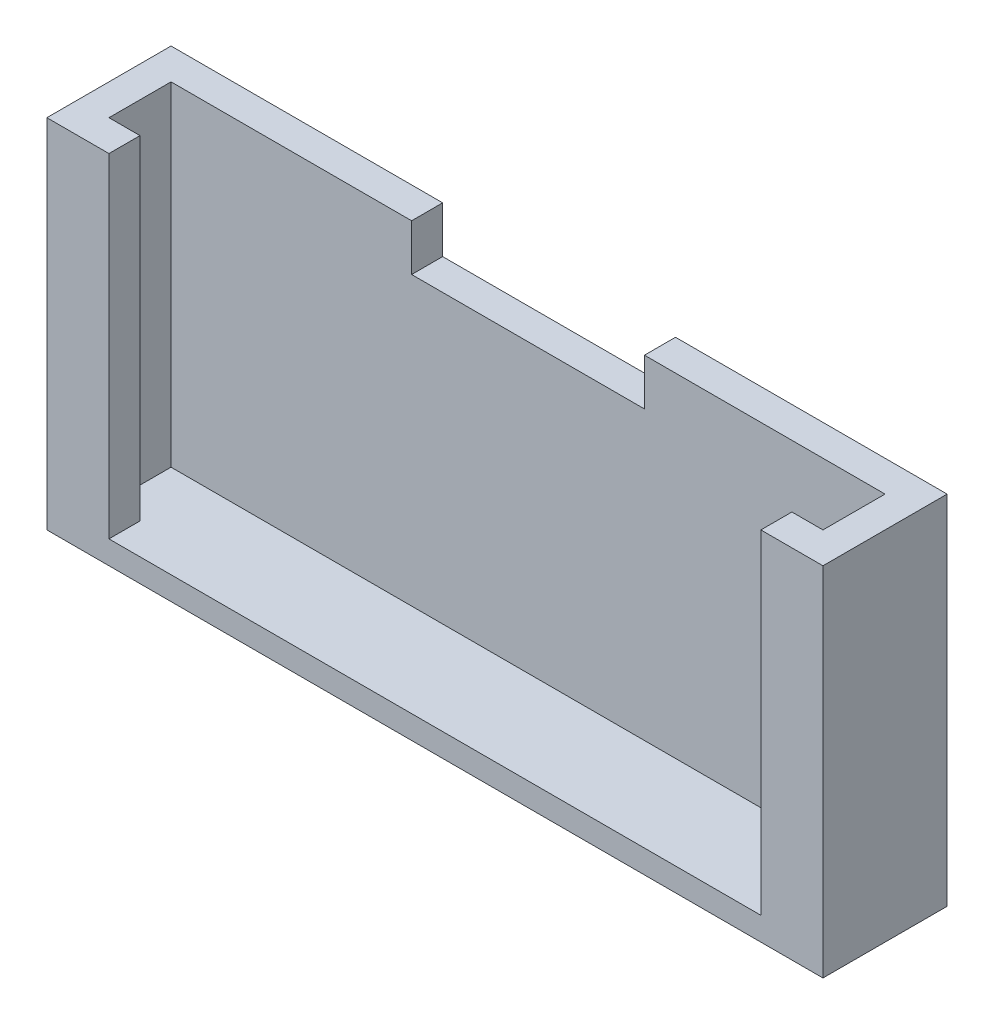
ISO-10303-21;
HEADER;
FILE_DESCRIPTION(('STEP AP214'),'2;1');
FILE_NAME('part.step','',(''),(''),'','','');
FILE_SCHEMA(('AUTOMOTIVE_DESIGN { 1 0 10303 214 1 1 1 1 }'));
ENDSEC;
DATA;
#1=APPLICATION_CONTEXT('core data for automotive mechanical design processes');
#2=APPLICATION_PROTOCOL_DEFINITION('international standard','automotive_design',2000,#1);
#3=PRODUCT_CONTEXT('',#1,'mechanical');
#4=PRODUCT('Part','Part','',(#3));
#5=PRODUCT_RELATED_PRODUCT_CATEGORY('part','',(#4));
#6=PRODUCT_DEFINITION_FORMATION('','',#4);
#7=PRODUCT_DEFINITION_CONTEXT('part definition',#1,'design');
#8=PRODUCT_DEFINITION('design','',#6,#7);
#9=PRODUCT_DEFINITION_SHAPE('','',#8);
#10=(LENGTH_UNIT() NAMED_UNIT(*) SI_UNIT(.MILLI.,.METRE.));
#11=(NAMED_UNIT(*) PLANE_ANGLE_UNIT() SI_UNIT($,.RADIAN.));
#12=(NAMED_UNIT(*) SI_UNIT($,.STERADIAN.) SOLID_ANGLE_UNIT());
#13=UNCERTAINTY_MEASURE_WITH_UNIT(LENGTH_MEASURE(1.E-05),#10,'distance_accuracy_value','');
#14=(GEOMETRIC_REPRESENTATION_CONTEXT(3) GLOBAL_UNCERTAINTY_ASSIGNED_CONTEXT((#13)) GLOBAL_UNIT_ASSIGNED_CONTEXT((#10,
#11,#12)) REPRESENTATION_CONTEXT('',''));
#15=CARTESIAN_POINT('',(0.,0.,0.));
#16=DIRECTION('',(0.,0.,1.));
#17=DIRECTION('',(1.,0.,0.));
#18=AXIS2_PLACEMENT_3D('',#15,#16,#17);
#19=CARTESIAN_POINT('',(-25.,11.5,2.));
#20=DIRECTION('',(0.,-1.,0.));
#21=DIRECTION('',(0.,0.,-1.));
#22=AXIS2_PLACEMENT_3D('',#19,#20,#21);
#23=PLANE('',#22);
#24=DIRECTION('',(-1.,0.,0.));
#25=VECTOR('',#24,1.);
#26=CARTESIAN_POINT('',(-25.,11.5,0.));
#27=LINE('',#26,#25);
#28=CARTESIAN_POINT('',(25.,11.5,0.));
#29=VERTEX_POINT('',#28);
#30=CARTESIAN_POINT('',(7.50000000000001,11.5,0.));
#31=VERTEX_POINT('',#30);
#32=EDGE_CURVE('E255',#29,#31,#27,.T.);
#33=ORIENTED_EDGE('',*,*,#32,.T.);
#34=DIRECTION('',(0.,0.,1.));
#35=VECTOR('',#34,1.);
#36=CARTESIAN_POINT('',(7.5,11.5,2.));
#37=LINE('',#36,#35);
#38=CARTESIAN_POINT('',(7.50000000000001,11.5,2.));
#39=VERTEX_POINT('',#38);
#40=EDGE_CURVE('E178',#31,#39,#37,.T.);
#41=ORIENTED_EDGE('',*,*,#40,.T.);
#42=DIRECTION('',(-1.,0.,0.));
#43=VECTOR('',#42,1.);
#44=CARTESIAN_POINT('',(-23.,11.5,2.));
#45=LINE('',#44,#43);
#46=CARTESIAN_POINT('',(23.,11.5,2.));
#47=VERTEX_POINT('',#46);
#48=EDGE_CURVE('E224',#47,#39,#45,.T.);
#49=ORIENTED_EDGE('',*,*,#48,.F.);
#50=DIRECTION('',(0.,0.,1.));
#51=VECTOR('',#50,1.);
#52=CARTESIAN_POINT('',(23.,11.5,2.));
#53=LINE('',#52,#51);
#54=CARTESIAN_POINT('',(23.,11.5,6.));
#55=VERTEX_POINT('',#54);
#56=EDGE_CURVE('E227',#47,#55,#53,.T.);
#57=ORIENTED_EDGE('',*,*,#56,.T.);
#58=DIRECTION('',(1.,0.,0.));
#59=VECTOR('',#58,1.);
#60=CARTESIAN_POINT('',(21.,11.5,6.));
#61=LINE('',#60,#59);
#62=CARTESIAN_POINT('',(21.,11.5,6.));
#63=VERTEX_POINT('',#62);
#64=EDGE_CURVE('E212',#63,#55,#61,.T.);
#65=ORIENTED_EDGE('',*,*,#64,.F.);
#66=DIRECTION('',(0.,0.,-1.));
#67=VECTOR('',#66,1.);
#68=CARTESIAN_POINT('',(21.,11.5,0.));
#69=LINE('',#68,#67);
#70=CARTESIAN_POINT('',(21.,11.5,8.));
#71=VERTEX_POINT('',#70);
#72=EDGE_CURVE('E196',#71,#63,#69,.T.);
#73=ORIENTED_EDGE('',*,*,#72,.F.);
#74=DIRECTION('',(-1.,0.,0.));
#75=VECTOR('',#74,1.);
#76=CARTESIAN_POINT('',(-25.,11.5,8.));
#77=LINE('',#76,#75);
#78=CARTESIAN_POINT('',(25.,11.5,8.));
#79=VERTEX_POINT('',#78);
#80=EDGE_CURVE('E250',#79,#71,#77,.T.);
#81=ORIENTED_EDGE('',*,*,#80,.F.);
#82=DIRECTION('',(0.,0.,-1.));
#83=VECTOR('',#82,1.);
#84=CARTESIAN_POINT('',(25.,11.5,2.));
#85=LINE('',#84,#83);
#86=EDGE_CURVE('E43',#79,#29,#85,.T.);
#87=ORIENTED_EDGE('',*,*,#86,.T.);
#88=EDGE_LOOP('',(#33,#41,#49,#57,#65,#73,#81,#87));
#89=FACE_BOUND('',#88,.T.);
#90=ADVANCED_FACE('F35',(#89),#23,.F.);
#91=CARTESIAN_POINT('',(-23.,-10.,4.));
#92=DIRECTION('',(0.,-1.,0.));
#93=DIRECTION('',(0.,0.,-1.));
#94=AXIS2_PLACEMENT_3D('',#91,#92,#93);
#95=PLANE('',#94);
#96=DIRECTION('',(-1.,0.,0.));
#97=VECTOR('',#96,1.);
#98=CARTESIAN_POINT('',(-21.,-10.,6.));
#99=LINE('',#98,#97);
#100=CARTESIAN_POINT('',(-21.,-10.,6.));
#101=VERTEX_POINT('',#100);
#102=CARTESIAN_POINT('',(-23.,-10.,6.));
#103=VERTEX_POINT('',#102);
#104=EDGE_CURVE('E193',#101,#103,#99,.T.);
#105=ORIENTED_EDGE('',*,*,#104,.F.);
#106=DIRECTION('',(0.,0.,-1.));
#107=VECTOR('',#106,1.);
#108=CARTESIAN_POINT('',(-21.,-10.,8.));
#109=LINE('',#108,#107);
#110=CARTESIAN_POINT('',(-21.,-10.,8.));
#111=VERTEX_POINT('',#110);
#112=EDGE_CURVE('E184',#111,#101,#109,.T.);
#113=ORIENTED_EDGE('',*,*,#112,.F.);
#114=DIRECTION('',(1.,0.,0.));
#115=VECTOR('',#114,1.);
#116=CARTESIAN_POINT('',(-23.,-10.,8.));
#117=LINE('',#116,#115);
#118=CARTESIAN_POINT('',(21.,-10.,8.));
#119=VERTEX_POINT('',#118);
#120=EDGE_CURVE('E232',#111,#119,#117,.T.);
#121=ORIENTED_EDGE('',*,*,#120,.T.);
#122=DIRECTION('',(0.,0.,1.));
#123=VECTOR('',#122,1.);
#124=CARTESIAN_POINT('',(21.,-10.,0.));
#125=LINE('',#124,#123);
#126=CARTESIAN_POINT('',(21.,-10.,6.));
#127=VERTEX_POINT('',#126);
#128=EDGE_CURVE('E202',#127,#119,#125,.T.);
#129=ORIENTED_EDGE('',*,*,#128,.F.);
#130=DIRECTION('',(1.,0.,0.));
#131=VECTOR('',#130,1.);
#132=CARTESIAN_POINT('',(21.,-10.,6.));
#133=LINE('',#132,#131);
#134=CARTESIAN_POINT('',(23.,-10.,6.));
#135=VERTEX_POINT('',#134);
#136=EDGE_CURVE('E208',#127,#135,#133,.T.);
#137=ORIENTED_EDGE('',*,*,#136,.T.);
#138=DIRECTION('',(0.,0.,1.));
#139=VECTOR('',#138,1.);
#140=CARTESIAN_POINT('',(23.,-10.,4.));
#141=LINE('',#140,#139);
#142=CARTESIAN_POINT('',(23.,-10.,2.));
#143=VERTEX_POINT('',#142);
#144=EDGE_CURVE('E235',#143,#135,#141,.T.);
#145=ORIENTED_EDGE('',*,*,#144,.F.);
#146=DIRECTION('',(1.,0.,0.));
#147=VECTOR('',#146,1.);
#148=CARTESIAN_POINT('',(-23.,-10.,2.));
#149=LINE('',#148,#147);
#150=CARTESIAN_POINT('',(-23.,-10.,2.));
#151=VERTEX_POINT('',#150);
#152=EDGE_CURVE('E217',#151,#143,#149,.T.);
#153=ORIENTED_EDGE('',*,*,#152,.F.);
#154=DIRECTION('',(0.,0.,1.));
#155=VECTOR('',#154,1.);
#156=CARTESIAN_POINT('',(-23.,-10.,4.));
#157=LINE('',#156,#155);
#158=EDGE_CURVE('E234',#151,#103,#157,.T.);
#159=ORIENTED_EDGE('',*,*,#158,.T.);
#160=EDGE_LOOP('',(#105,#113,#121,#129,#137,#145,#153,#159));
#161=FACE_BOUND('',#160,.T.);
#162=ADVANCED_FACE('F316',(#161),#95,.F.);
#163=CARTESIAN_POINT('',(-23.,10.,4.));
#164=DIRECTION('',(-1.,0.,0.));
#165=DIRECTION('',(0.,-1.,0.));
#166=AXIS2_PLACEMENT_3D('',#163,#164,#165);
#167=PLANE('',#166);
#168=DIRECTION('',(0.,1.,0.));
#169=VECTOR('',#168,1.);
#170=CARTESIAN_POINT('',(-23.,11.5,6.));
#171=LINE('',#170,#169);
#172=CARTESIAN_POINT('',(-23.,11.5,6.));
#173=VERTEX_POINT('',#172);
#174=EDGE_CURVE('E181',#103,#173,#171,.T.);
#175=ORIENTED_EDGE('',*,*,#174,.F.);
#176=ORIENTED_EDGE('',*,*,#158,.F.);
#177=DIRECTION('',(0.,-1.,0.));
#178=VECTOR('',#177,1.);
#179=CARTESIAN_POINT('',(-23.,11.5,2.));
#180=LINE('',#179,#178);
#181=CARTESIAN_POINT('',(-23.,11.5,2.));
#182=VERTEX_POINT('',#181);
#183=EDGE_CURVE('E214',#182,#151,#180,.T.);
#184=ORIENTED_EDGE('',*,*,#183,.F.);
#185=DIRECTION('',(0.,0.,-1.));
#186=VECTOR('',#185,1.);
#187=CARTESIAN_POINT('',(-23.,11.5,2.));
#188=LINE('',#187,#186);
#189=EDGE_CURVE('E230',#173,#182,#188,.T.);
#190=ORIENTED_EDGE('',*,*,#189,.F.);
#191=EDGE_LOOP('',(#175,#176,#184,#190));
#192=FACE_BOUND('',#191,.T.);
#193=ADVANCED_FACE('F313',(#192),#167,.F.);
#194=CARTESIAN_POINT('',(23.,10.,4.));
#195=DIRECTION('',(1.,0.,0.));
#196=DIRECTION('',(0.,0.,-1.));
#197=AXIS2_PLACEMENT_3D('',#194,#195,#196);
#198=PLANE('',#197);
#199=DIRECTION('',(0.,-1.,0.));
#200=VECTOR('',#199,1.);
#201=CARTESIAN_POINT('',(23.,0.,6.));
#202=LINE('',#201,#200);
#203=EDGE_CURVE('E195',#55,#135,#202,.T.);
#204=ORIENTED_EDGE('',*,*,#203,.F.);
#205=ORIENTED_EDGE('',*,*,#56,.F.);
#206=DIRECTION('',(0.,1.,0.));
#207=VECTOR('',#206,1.);
#208=CARTESIAN_POINT('',(23.,11.5,2.));
#209=LINE('',#208,#207);
#210=EDGE_CURVE('E220',#143,#47,#209,.T.);
#211=ORIENTED_EDGE('',*,*,#210,.F.);
#212=ORIENTED_EDGE('',*,*,#144,.T.);
#213=EDGE_LOOP('',(#204,#205,#211,#212));
#214=FACE_BOUND('',#213,.T.);
#215=ADVANCED_FACE('F288',(#214),#198,.F.);
#216=CARTESIAN_POINT('',(25.,11.5,2.));
#217=DIRECTION('',(-1.,0.,0.));
#218=DIRECTION('',(0.,-1.,0.));
#219=AXIS2_PLACEMENT_3D('',#216,#217,#218);
#220=PLANE('',#219);
#221=DIRECTION('',(0.,1.,0.));
#222=VECTOR('',#221,1.);
#223=CARTESIAN_POINT('',(25.,11.5,0.));
#224=LINE('',#223,#222);
#225=CARTESIAN_POINT('',(25.,-11.5,0.));
#226=VERTEX_POINT('',#225);
#227=EDGE_CURVE('E252',#226,#29,#224,.T.);
#228=ORIENTED_EDGE('',*,*,#227,.T.);
#229=ORIENTED_EDGE('',*,*,#86,.F.);
#230=DIRECTION('',(0.,1.,0.));
#231=VECTOR('',#230,1.);
#232=CARTESIAN_POINT('',(25.,11.5,8.));
#233=LINE('',#232,#231);
#234=CARTESIAN_POINT('',(25.,-11.5,8.));
#235=VERTEX_POINT('',#234);
#236=EDGE_CURVE('E246',#235,#79,#233,.T.);
#237=ORIENTED_EDGE('',*,*,#236,.F.);
#238=DIRECTION('',(0.,0.,-1.));
#239=VECTOR('',#238,1.);
#240=CARTESIAN_POINT('',(25.,-11.5,2.));
#241=LINE('',#240,#239);
#242=EDGE_CURVE('E262',#235,#226,#241,.T.);
#243=ORIENTED_EDGE('',*,*,#242,.T.);
#244=EDGE_LOOP('',(#228,#229,#237,#243));
#245=FACE_BOUND('',#244,.T.);
#246=ADVANCED_FACE('F37',(#245),#220,.F.);
#247=CARTESIAN_POINT('',(-7.49999999999999,11.5,2.));
#248=VERTEX_POINT('',#247);
#249=EDGE_CURVE('E223',#248,#182,#45,.T.);
#250=ORIENTED_EDGE('',*,*,#249,.F.);
#251=DIRECTION('',(0.,0.,-1.));
#252=VECTOR('',#251,1.);
#253=CARTESIAN_POINT('',(-7.5,11.5,2.));
#254=LINE('',#253,#252);
#255=CARTESIAN_POINT('',(-7.49999999999999,11.5,0.));
#256=VERTEX_POINT('',#255);
#257=EDGE_CURVE('E49',#248,#256,#254,.T.);
#258=ORIENTED_EDGE('',*,*,#257,.T.);
#259=CARTESIAN_POINT('',(-25.,11.5,0.));
#260=VERTEX_POINT('',#259);
#261=EDGE_CURVE('E167',#256,#260,#27,.T.);
#262=ORIENTED_EDGE('',*,*,#261,.T.);
#263=DIRECTION('',(0.,0.,-1.));
#264=VECTOR('',#263,1.);
#265=CARTESIAN_POINT('',(-25.,11.5,2.));
#266=LINE('',#265,#264);
#267=CARTESIAN_POINT('',(-25.,11.5,8.));
#268=VERTEX_POINT('',#267);
#269=EDGE_CURVE('E268',#268,#260,#266,.T.);
#270=ORIENTED_EDGE('',*,*,#269,.F.);
#271=CARTESIAN_POINT('',(-21.,11.5,8.));
#272=VERTEX_POINT('',#271);
#273=EDGE_CURVE('E249',#272,#268,#77,.T.);
#274=ORIENTED_EDGE('',*,*,#273,.F.);
#275=DIRECTION('',(0.,0.,1.));
#276=VECTOR('',#275,1.);
#277=CARTESIAN_POINT('',(-21.,11.5,8.));
#278=LINE('',#277,#276);
#279=CARTESIAN_POINT('',(-21.,11.5,6.));
#280=VERTEX_POINT('',#279);
#281=EDGE_CURVE('E188',#280,#272,#278,.T.);
#282=ORIENTED_EDGE('',*,*,#281,.F.);
#283=DIRECTION('',(-1.,0.,0.));
#284=VECTOR('',#283,1.);
#285=CARTESIAN_POINT('',(-21.,11.5,6.));
#286=LINE('',#285,#284);
#287=EDGE_CURVE('E57',#280,#173,#286,.T.);
#288=ORIENTED_EDGE('',*,*,#287,.T.);
#289=ORIENTED_EDGE('',*,*,#189,.T.);
#290=EDGE_LOOP('',(#250,#258,#262,#270,#274,#282,#288,#289));
#291=FACE_BOUND('',#290,.T.);
#292=ADVANCED_FACE('F308',(#291),#23,.F.);
#293=CARTESIAN_POINT('',(-25.,11.5,2.));
#294=DIRECTION('',(1.,0.,0.));
#295=DIRECTION('',(0.,1.,0.));
#296=AXIS2_PLACEMENT_3D('',#293,#294,#295);
#297=PLANE('',#296);
#298=DIRECTION('',(0.,-1.,0.));
#299=VECTOR('',#298,1.);
#300=CARTESIAN_POINT('',(-25.,11.5,0.));
#301=LINE('',#300,#299);
#302=CARTESIAN_POINT('',(-25.,-11.5,0.));
#303=VERTEX_POINT('',#302);
#304=EDGE_CURVE('E258',#260,#303,#301,.T.);
#305=ORIENTED_EDGE('',*,*,#304,.T.);
#306=DIRECTION('',(0.,0.,-1.));
#307=VECTOR('',#306,1.);
#308=CARTESIAN_POINT('',(-25.,-11.5,2.));
#309=LINE('',#308,#307);
#310=CARTESIAN_POINT('',(-25.,-11.5,8.));
#311=VERTEX_POINT('',#310);
#312=EDGE_CURVE('E265',#311,#303,#309,.T.);
#313=ORIENTED_EDGE('',*,*,#312,.F.);
#314=DIRECTION('',(0.,-1.,0.));
#315=VECTOR('',#314,1.);
#316=CARTESIAN_POINT('',(-25.,11.5,8.));
#317=LINE('',#316,#315);
#318=EDGE_CURVE('E238',#268,#311,#317,.T.);
#319=ORIENTED_EDGE('',*,*,#318,.F.);
#320=ORIENTED_EDGE('',*,*,#269,.T.);
#321=EDGE_LOOP('',(#305,#313,#319,#320));
#322=FACE_BOUND('',#321,.T.);
#323=ADVANCED_FACE('F305',(#322),#297,.F.);
#324=CARTESIAN_POINT('',(-25.,-11.5,2.));
#325=DIRECTION('',(0.,1.,0.));
#326=DIRECTION('',(0.,0.,1.));
#327=AXIS2_PLACEMENT_3D('',#324,#325,#326);
#328=PLANE('',#327);
#329=DIRECTION('',(1.,0.,0.));
#330=VECTOR('',#329,1.);
#331=CARTESIAN_POINT('',(-25.,-11.5,0.));
#332=LINE('',#331,#330);
#333=EDGE_CURVE('E260',#303,#226,#332,.T.);
#334=ORIENTED_EDGE('',*,*,#333,.T.);
#335=ORIENTED_EDGE('',*,*,#242,.F.);
#336=DIRECTION('',(1.,0.,0.));
#337=VECTOR('',#336,1.);
#338=CARTESIAN_POINT('',(-25.,-11.5,8.));
#339=LINE('',#338,#337);
#340=EDGE_CURVE('E243',#311,#235,#339,.T.);
#341=ORIENTED_EDGE('',*,*,#340,.F.);
#342=ORIENTED_EDGE('',*,*,#312,.T.);
#343=EDGE_LOOP('',(#334,#335,#341,#342));
#344=FACE_BOUND('',#343,.T.);
#345=ADVANCED_FACE('F303',(#344),#328,.F.);
#346=CARTESIAN_POINT('',(0.,0.,0.));
#347=DIRECTION('',(0.,0.,1.));
#348=DIRECTION('',(1.,0.,0.));
#349=AXIS2_PLACEMENT_3D('',#346,#347,#348);
#350=PLANE('',#349);
#351=DIRECTION('',(1.,0.,0.));
#352=VECTOR('',#351,1.);
#353=CARTESIAN_POINT('',(-7.49999999999999,8.5,0.));
#354=LINE('',#353,#352);
#355=CARTESIAN_POINT('',(-7.49999999999999,8.5,0.));
#356=VERTEX_POINT('',#355);
#357=CARTESIAN_POINT('',(7.50000000000001,8.5,0.));
#358=VERTEX_POINT('',#357);
#359=EDGE_CURVE('E156',#356,#358,#354,.T.);
#360=ORIENTED_EDGE('',*,*,#359,.T.);
#361=DIRECTION('',(0.,1.,0.));
#362=VECTOR('',#361,1.);
#363=CARTESIAN_POINT('',(7.50000000000001,14.5,0.));
#364=LINE('',#363,#362);
#365=EDGE_CURVE('E168',#358,#31,#364,.T.);
#366=ORIENTED_EDGE('',*,*,#365,.T.);
#367=ORIENTED_EDGE('',*,*,#32,.F.);
#368=ORIENTED_EDGE('',*,*,#227,.F.);
#369=ORIENTED_EDGE('',*,*,#333,.F.);
#370=ORIENTED_EDGE('',*,*,#304,.F.);
#371=ORIENTED_EDGE('',*,*,#261,.F.);
#372=DIRECTION('',(0.,-1.,0.));
#373=VECTOR('',#372,1.);
#374=CARTESIAN_POINT('',(-7.49999999999999,14.5,0.));
#375=LINE('',#374,#373);
#376=EDGE_CURVE('E151',#256,#356,#375,.T.);
#377=ORIENTED_EDGE('',*,*,#376,.T.);
#378=EDGE_LOOP('',(#360,#366,#367,#368,#369,#370,#371,#377));
#379=FACE_BOUND('',#378,.T.);
#380=ADVANCED_FACE('F165',(#379),#350,.F.);
#381=CARTESIAN_POINT('',(0.,0.,8.));
#382=DIRECTION('',(0.,0.,1.));
#383=DIRECTION('',(1.,0.,0.));
#384=AXIS2_PLACEMENT_3D('',#381,#382,#383);
#385=PLANE('',#384);
#386=ORIENTED_EDGE('',*,*,#120,.F.);
#387=DIRECTION('',(0.,-1.,0.));
#388=VECTOR('',#387,1.);
#389=CARTESIAN_POINT('',(-21.,11.5,8.));
#390=LINE('',#389,#388);
#391=EDGE_CURVE('E182',#272,#111,#390,.T.);
#392=ORIENTED_EDGE('',*,*,#391,.F.);
#393=ORIENTED_EDGE('',*,*,#273,.T.);
#394=ORIENTED_EDGE('',*,*,#318,.T.);
#395=ORIENTED_EDGE('',*,*,#340,.T.);
#396=ORIENTED_EDGE('',*,*,#236,.T.);
#397=ORIENTED_EDGE('',*,*,#80,.T.);
#398=DIRECTION('',(0.,1.,0.));
#399=VECTOR('',#398,1.);
#400=CARTESIAN_POINT('',(21.,0.,8.));
#401=LINE('',#400,#399);
#402=EDGE_CURVE('E205',#119,#71,#401,.T.);
#403=ORIENTED_EDGE('',*,*,#402,.F.);
#404=EDGE_LOOP('',(#386,#392,#393,#394,#395,#396,#397,#403));
#405=FACE_BOUND('',#404,.T.);
#406=ADVANCED_FACE('F298',(#405),#385,.T.);
#407=CARTESIAN_POINT('',(0.,0.,2.));
#408=DIRECTION('',(0.,0.,1.));
#409=DIRECTION('',(1.,0.,0.));
#410=AXIS2_PLACEMENT_3D('',#407,#408,#409);
#411=PLANE('',#410);
#412=DIRECTION('',(0.,1.,0.));
#413=VECTOR('',#412,1.);
#414=CARTESIAN_POINT('',(7.50000000000001,14.5,2.));
#415=LINE('',#414,#413);
#416=CARTESIAN_POINT('',(7.50000000000001,8.5,2.));
#417=VERTEX_POINT('',#416);
#418=EDGE_CURVE('E173',#417,#39,#415,.T.);
#419=ORIENTED_EDGE('',*,*,#418,.F.);
#420=DIRECTION('',(1.,0.,0.));
#421=VECTOR('',#420,1.);
#422=CARTESIAN_POINT('',(-7.49999999999999,8.5,2.));
#423=LINE('',#422,#421);
#424=CARTESIAN_POINT('',(-7.49999999999999,8.5,2.));
#425=VERTEX_POINT('',#424);
#426=EDGE_CURVE('E170',#425,#417,#423,.T.);
#427=ORIENTED_EDGE('',*,*,#426,.F.);
#428=DIRECTION('',(0.,-1.,0.));
#429=VECTOR('',#428,1.);
#430=CARTESIAN_POINT('',(-7.49999999999999,0.,2.));
#431=LINE('',#430,#429);
#432=EDGE_CURVE('E11',#248,#425,#431,.T.);
#433=ORIENTED_EDGE('',*,*,#432,.F.);
#434=ORIENTED_EDGE('',*,*,#249,.T.);
#435=ORIENTED_EDGE('',*,*,#183,.T.);
#436=ORIENTED_EDGE('',*,*,#152,.T.);
#437=ORIENTED_EDGE('',*,*,#210,.T.);
#438=ORIENTED_EDGE('',*,*,#48,.T.);
#439=EDGE_LOOP('',(#419,#427,#433,#434,#435,#436,#437,#438));
#440=FACE_BOUND('',#439,.T.);
#441=ADVANCED_FACE('F283',(#440),#411,.T.);
#442=CARTESIAN_POINT('',(21.,0.,6.));
#443=DIRECTION('',(0.,0.,1.));
#444=DIRECTION('',(0.,-1.,0.));
#445=AXIS2_PLACEMENT_3D('',#442,#443,#444);
#446=PLANE('',#445);
#447=ORIENTED_EDGE('',*,*,#203,.T.);
#448=ORIENTED_EDGE('',*,*,#136,.F.);
#449=DIRECTION('',(0.,-1.,0.));
#450=VECTOR('',#449,1.);
#451=CARTESIAN_POINT('',(21.,0.,6.));
#452=LINE('',#451,#450);
#453=EDGE_CURVE('E199',#63,#127,#452,.T.);
#454=ORIENTED_EDGE('',*,*,#453,.F.);
#455=ORIENTED_EDGE('',*,*,#64,.T.);
#456=EDGE_LOOP('',(#447,#448,#454,#455));
#457=FACE_BOUND('',#456,.T.);
#458=ADVANCED_FACE('F291',(#457),#446,.F.);
#459=CARTESIAN_POINT('',(21.,0.,0.));
#460=DIRECTION('',(-1.,0.,0.));
#461=DIRECTION('',(0.,0.,1.));
#462=AXIS2_PLACEMENT_3D('',#459,#460,#461);
#463=PLANE('',#462);
#464=ORIENTED_EDGE('',*,*,#72,.T.);
#465=ORIENTED_EDGE('',*,*,#453,.T.);
#466=ORIENTED_EDGE('',*,*,#128,.T.);
#467=ORIENTED_EDGE('',*,*,#402,.T.);
#468=EDGE_LOOP('',(#464,#465,#466,#467));
#469=FACE_BOUND('',#468,.T.);
#470=ADVANCED_FACE('F294',(#469),#463,.T.);
#471=CARTESIAN_POINT('',(-21.,11.5,6.));
#472=DIRECTION('',(0.,0.,1.));
#473=DIRECTION('',(0.,-1.,0.));
#474=AXIS2_PLACEMENT_3D('',#471,#472,#473);
#475=PLANE('',#474);
#476=ORIENTED_EDGE('',*,*,#174,.T.);
#477=ORIENTED_EDGE('',*,*,#287,.F.);
#478=DIRECTION('',(0.,1.,0.));
#479=VECTOR('',#478,1.);
#480=CARTESIAN_POINT('',(-21.,11.5,6.));
#481=LINE('',#480,#479);
#482=EDGE_CURVE('E186',#101,#280,#481,.T.);
#483=ORIENTED_EDGE('',*,*,#482,.F.);
#484=ORIENTED_EDGE('',*,*,#104,.T.);
#485=EDGE_LOOP('',(#476,#477,#483,#484));
#486=FACE_BOUND('',#485,.T.);
#487=ADVANCED_FACE('F322',(#486),#475,.F.);
#488=CARTESIAN_POINT('',(-21.,0.,0.));
#489=DIRECTION('',(1.,0.,0.));
#490=DIRECTION('',(0.,1.,0.));
#491=AXIS2_PLACEMENT_3D('',#488,#489,#490);
#492=PLANE('',#491);
#493=ORIENTED_EDGE('',*,*,#391,.T.);
#494=ORIENTED_EDGE('',*,*,#112,.T.);
#495=ORIENTED_EDGE('',*,*,#482,.T.);
#496=ORIENTED_EDGE('',*,*,#281,.T.);
#497=EDGE_LOOP('',(#493,#494,#495,#496));
#498=FACE_BOUND('',#497,.T.);
#499=ADVANCED_FACE('F320',(#498),#492,.T.);
#500=CARTESIAN_POINT('',(7.50000000000001,14.5,0.));
#501=DIRECTION('',(1.,0.,0.));
#502=DIRECTION('',(0.,1.,0.));
#503=AXIS2_PLACEMENT_3D('',#500,#501,#502);
#504=PLANE('',#503);
#505=ORIENTED_EDGE('',*,*,#365,.F.);
#506=DIRECTION('',(0.,0.,1.));
#507=VECTOR('',#506,1.);
#508=CARTESIAN_POINT('',(7.50000000000001,8.5,0.));
#509=LINE('',#508,#507);
#510=EDGE_CURVE('E155',#358,#417,#509,.T.);
#511=ORIENTED_EDGE('',*,*,#510,.T.);
#512=ORIENTED_EDGE('',*,*,#418,.T.);
#513=ORIENTED_EDGE('',*,*,#40,.F.);
#514=EDGE_LOOP('',(#505,#511,#512,#513));
#515=FACE_BOUND('',#514,.T.);
#516=ADVANCED_FACE('F279',(#515),#504,.F.);
#517=CARTESIAN_POINT('',(-7.49999999999999,14.5,0.));
#518=DIRECTION('',(-1.,0.,0.));
#519=DIRECTION('',(0.,-1.,0.));
#520=AXIS2_PLACEMENT_3D('',#517,#518,#519);
#521=PLANE('',#520);
#522=ORIENTED_EDGE('',*,*,#432,.T.);
#523=DIRECTION('',(0.,0.,1.));
#524=VECTOR('',#523,1.);
#525=CARTESIAN_POINT('',(-7.49999999999999,8.5,0.));
#526=LINE('',#525,#524);
#527=EDGE_CURVE('E147',#356,#425,#526,.T.);
#528=ORIENTED_EDGE('',*,*,#527,.F.);
#529=ORIENTED_EDGE('',*,*,#376,.F.);
#530=ORIENTED_EDGE('',*,*,#257,.F.);
#531=EDGE_LOOP('',(#522,#528,#529,#530));
#532=FACE_BOUND('',#531,.T.);
#533=ADVANCED_FACE('F149',(#532),#521,.F.);
#534=CARTESIAN_POINT('',(-7.49999999999999,8.5,0.));
#535=DIRECTION('',(0.,-1.,0.));
#536=DIRECTION('',(0.,0.,-1.));
#537=AXIS2_PLACEMENT_3D('',#534,#535,#536);
#538=PLANE('',#537);
#539=ORIENTED_EDGE('',*,*,#426,.T.);
#540=ORIENTED_EDGE('',*,*,#510,.F.);
#541=ORIENTED_EDGE('',*,*,#359,.F.);
#542=ORIENTED_EDGE('',*,*,#527,.T.);
#543=EDGE_LOOP('',(#539,#540,#541,#542));
#544=FACE_BOUND('',#543,.T.);
#545=ADVANCED_FACE('F159',(#544),#538,.F.);
#546=CLOSED_SHELL('',(#90,#162,#193,#215,#246,#292,#323,#345,#380,#406,#441,#458,#470,#487,#499,
#516,#533,#545));
#547=MANIFOLD_SOLID_BREP('B2',#546);
#548=ADVANCED_BREP_SHAPE_REPRESENTATION('',(#18,#547),#14);
#549=SHAPE_DEFINITION_REPRESENTATION(#9,#548);
ENDSEC;
END-ISO-10303-21;
